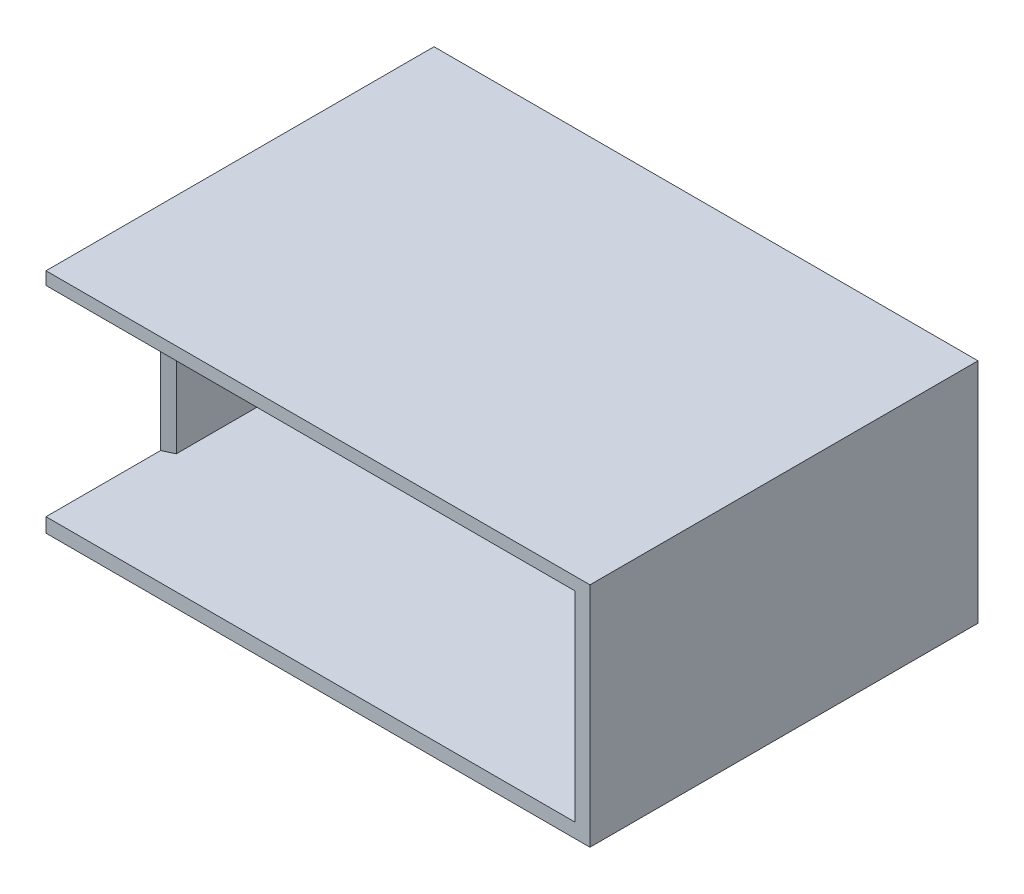
ISO-10303-21;
HEADER;
FILE_DESCRIPTION(('STEP AP214'),'2;1');
FILE_NAME('part.step','',(''),(''),'','','');
FILE_SCHEMA(('AUTOMOTIVE_DESIGN { 1 0 10303 214 1 1 1 1 }'));
ENDSEC;
DATA;
#1=APPLICATION_CONTEXT('core data for automotive mechanical design processes');
#2=APPLICATION_PROTOCOL_DEFINITION('international standard','automotive_design',2000,#1);
#3=PRODUCT_CONTEXT('',#1,'mechanical');
#4=PRODUCT('Part','Part','',(#3));
#5=PRODUCT_RELATED_PRODUCT_CATEGORY('part','',(#4));
#6=PRODUCT_DEFINITION_FORMATION('','',#4);
#7=PRODUCT_DEFINITION_CONTEXT('part definition',#1,'design');
#8=PRODUCT_DEFINITION('design','',#6,#7);
#9=PRODUCT_DEFINITION_SHAPE('','',#8);
#10=(LENGTH_UNIT() NAMED_UNIT(*) SI_UNIT(.MILLI.,.METRE.));
#11=(NAMED_UNIT(*) PLANE_ANGLE_UNIT() SI_UNIT($,.RADIAN.));
#12=(NAMED_UNIT(*) SI_UNIT($,.STERADIAN.) SOLID_ANGLE_UNIT());
#13=UNCERTAINTY_MEASURE_WITH_UNIT(LENGTH_MEASURE(1.E-05),#10,'distance_accuracy_value','');
#14=(GEOMETRIC_REPRESENTATION_CONTEXT(3) GLOBAL_UNCERTAINTY_ASSIGNED_CONTEXT((#13)) GLOBAL_UNIT_ASSIGNED_CONTEXT((#10,
#11,#12)) REPRESENTATION_CONTEXT('',''));
#15=CARTESIAN_POINT('',(0.,0.,0.));
#16=DIRECTION('',(0.,0.,1.));
#17=DIRECTION('',(1.,0.,0.));
#18=AXIS2_PLACEMENT_3D('',#15,#16,#17);
#19=CARTESIAN_POINT('',(0.,0.,25.));
#20=DIRECTION('',(0.,0.,1.));
#21=DIRECTION('',(1.,0.,0.));
#22=AXIS2_PLACEMENT_3D('',#19,#20,#21);
#23=PLANE('',#22);
#24=DIRECTION('',(0.,1.,0.));
#25=VECTOR('',#24,1.);
#26=CARTESIAN_POINT('',(167.877013546446,9.92918665697389,25.));
#27=LINE('',#26,#25);
#28=CARTESIAN_POINT('',(167.877013546446,-7.37195892888554,25.));
#29=VERTEX_POINT('',#28);
#30=CARTESIAN_POINT('',(167.877013546446,7.27222180922199,25.));
#31=VERTEX_POINT('',#30);
#32=EDGE_CURVE('E86',#29,#31,#27,.T.);
#33=ORIENTED_EDGE('',*,*,#32,.T.);
#34=DIRECTION('',(1.,0.,0.));
#35=VECTOR('',#34,1.);
#36=CARTESIAN_POINT('',(0.,7.27222180922201,25.));
#37=LINE('',#36,#35);
#38=CARTESIAN_POINT('',(132.830272958444,7.27222180922199,25.));
#39=VERTEX_POINT('',#38);
#40=EDGE_CURVE('E217',#39,#31,#37,.T.);
#41=ORIENTED_EDGE('',*,*,#40,.F.);
#42=DIRECTION('',(0.,-1.,0.));
#43=VECTOR('',#42,1.);
#44=CARTESIAN_POINT('',(132.830272958444,-41.717928267604,25.));
#45=LINE('',#44,#43);
#46=CARTESIAN_POINT('',(132.830272958444,6.44999999999998,25.));
#47=VERTEX_POINT('',#46);
#48=EDGE_CURVE('E234',#39,#47,#45,.T.);
#49=ORIENTED_EDGE('',*,*,#48,.T.);
#50=DIRECTION('',(-1.,0.,0.));
#51=VECTOR('',#50,1.);
#52=CARTESIAN_POINT('',(0.,6.44999999999997,25.));
#53=LINE('',#52,#51);
#54=CARTESIAN_POINT('',(166.919342789878,6.44999999999997,25.));
#55=VERTEX_POINT('',#54);
#56=EDGE_CURVE('E297',#55,#47,#53,.T.);
#57=ORIENTED_EDGE('',*,*,#56,.F.);
#58=DIRECTION('',(0.,-1.,0.));
#59=VECTOR('',#58,1.);
#60=CARTESIAN_POINT('',(166.919342789878,6.44999999999997,25.));
#61=LINE('',#60,#59);
#62=CARTESIAN_POINT('',(166.919342789878,-6.45000000000002,25.));
#63=VERTEX_POINT('',#62);
#64=EDGE_CURVE('E256',#55,#63,#61,.T.);
#65=ORIENTED_EDGE('',*,*,#64,.T.);
#66=DIRECTION('',(1.,0.,0.));
#67=VECTOR('',#66,1.);
#68=CARTESIAN_POINT('',(0.,-6.45000000000003,25.));
#69=LINE('',#68,#67);
#70=CARTESIAN_POINT('',(132.830272958444,-6.45000000000003,25.));
#71=VERTEX_POINT('',#70);
#72=EDGE_CURVE('E303',#71,#63,#69,.T.);
#73=ORIENTED_EDGE('',*,*,#72,.F.);
#74=CARTESIAN_POINT('',(132.830272958444,-7.37195892888554,25.));
#75=VERTEX_POINT('',#74);
#76=EDGE_CURVE('E230',#71,#75,#45,.T.);
#77=ORIENTED_EDGE('',*,*,#76,.T.);
#78=DIRECTION('',(-1.,0.,0.));
#79=VECTOR('',#78,1.);
#80=CARTESIAN_POINT('',(0.,-7.37195892888554,25.));
#81=LINE('',#80,#79);
#82=EDGE_CURVE('E211',#29,#75,#81,.T.);
#83=ORIENTED_EDGE('',*,*,#82,.F.);
#84=EDGE_LOOP('',(#33,#41,#49,#57,#65,#73,#77,#83));
#85=FACE_BOUND('',#84,.T.);
#86=ADVANCED_FACE('F71',(#85),#23,.T.);
#87=CARTESIAN_POINT('',(0.,0.,0.));
#88=DIRECTION('',(0.,0.,1.));
#89=DIRECTION('',(1.,0.,0.));
#90=AXIS2_PLACEMENT_3D('',#87,#88,#89);
#91=PLANE('',#90);
#92=DIRECTION('',(1.,0.,0.));
#93=VECTOR('',#92,1.);
#94=CARTESIAN_POINT('',(133.519342789878,6.44999999999997,0.));
#95=LINE('',#94,#93);
#96=CARTESIAN_POINT('',(133.519342789878,6.44999999999997,0.));
#97=VERTEX_POINT('',#96);
#98=CARTESIAN_POINT('',(166.919342789878,6.44999999999998,0.));
#99=VERTEX_POINT('',#98);
#100=EDGE_CURVE('E341',#97,#99,#95,.T.);
#101=ORIENTED_EDGE('',*,*,#100,.F.);
#102=DIRECTION('',(0.,1.,0.));
#103=VECTOR('',#102,1.);
#104=CARTESIAN_POINT('',(133.519342789878,-6.45000000000003,0.));
#105=LINE('',#104,#103);
#106=CARTESIAN_POINT('',(133.519342789878,-6.45000000000003,0.));
#107=VERTEX_POINT('',#106);
#108=EDGE_CURVE('E310',#107,#97,#105,.T.);
#109=ORIENTED_EDGE('',*,*,#108,.F.);
#110=DIRECTION('',(-1.,0.,0.));
#111=VECTOR('',#110,1.);
#112=CARTESIAN_POINT('',(133.519342789878,-6.45000000000003,0.));
#113=LINE('',#112,#111);
#114=CARTESIAN_POINT('',(166.919342789878,-6.45000000000002,0.));
#115=VERTEX_POINT('',#114);
#116=EDGE_CURVE('E324',#115,#107,#113,.T.);
#117=ORIENTED_EDGE('',*,*,#116,.F.);
#118=DIRECTION('',(0.,-1.,0.));
#119=VECTOR('',#118,1.);
#120=CARTESIAN_POINT('',(166.919342789878,-6.45000000000002,0.));
#121=LINE('',#120,#119);
#122=EDGE_CURVE('E344',#99,#115,#121,.T.);
#123=ORIENTED_EDGE('',*,*,#122,.F.);
#124=EDGE_LOOP('',(#101,#109,#117,#123));
#125=FACE_BOUND('',#124,.T.);
#126=DIRECTION('',(1.,0.,0.));
#127=VECTOR('',#126,1.);
#128=CARTESIAN_POINT('',(0.,7.27222180922201,0.));
#129=LINE('',#128,#127);
#130=CARTESIAN_POINT('',(132.830272958444,7.27222180922199,0.));
#131=VERTEX_POINT('',#130);
#132=CARTESIAN_POINT('',(167.877013546446,7.27222180922199,0.));
#133=VERTEX_POINT('',#132);
#134=EDGE_CURVE('E94',#131,#133,#129,.T.);
#135=ORIENTED_EDGE('',*,*,#134,.T.);
#136=DIRECTION('',(0.,1.,0.));
#137=VECTOR('',#136,1.);
#138=CARTESIAN_POINT('',(167.877013546446,9.92918665697389,0.));
#139=LINE('',#138,#137);
#140=CARTESIAN_POINT('',(167.877013546446,-7.37195892888554,0.));
#141=VERTEX_POINT('',#140);
#142=EDGE_CURVE('E196',#141,#133,#139,.T.);
#143=ORIENTED_EDGE('',*,*,#142,.F.);
#144=DIRECTION('',(-1.,0.,0.));
#145=VECTOR('',#144,1.);
#146=CARTESIAN_POINT('',(0.,-7.37195892888554,0.));
#147=LINE('',#146,#145);
#148=CARTESIAN_POINT('',(132.830272958444,-7.37195892888554,0.));
#149=VERTEX_POINT('',#148);
#150=EDGE_CURVE('E202',#141,#149,#147,.T.);
#151=ORIENTED_EDGE('',*,*,#150,.T.);
#152=DIRECTION('',(0.,-1.,0.));
#153=VECTOR('',#152,1.);
#154=CARTESIAN_POINT('',(132.830272958444,-41.717928267604,0.));
#155=LINE('',#154,#153);
#156=EDGE_CURVE('E223',#131,#149,#155,.T.);
#157=ORIENTED_EDGE('',*,*,#156,.F.);
#158=EDGE_LOOP('',(#135,#143,#151,#157));
#159=FACE_BOUND('',#158,.T.);
#160=ADVANCED_FACE('F73',(#125,#159),#91,.F.);
#161=CARTESIAN_POINT('',(132.830272958444,-41.717928267604,25.));
#162=DIRECTION('',(1.,0.,0.));
#163=DIRECTION('',(0.,0.,-1.));
#164=AXIS2_PLACEMENT_3D('',#161,#162,#163);
#165=PLANE('',#164);
#166=DIRECTION('',(0.,0.,-1.));
#167=VECTOR('',#166,1.);
#168=CARTESIAN_POINT('',(132.830272958444,-7.37195892888554,25.));
#169=LINE('',#168,#167);
#170=EDGE_CURVE('E208',#75,#149,#169,.T.);
#171=ORIENTED_EDGE('',*,*,#170,.F.);
#172=ORIENTED_EDGE('',*,*,#76,.F.);
#173=DIRECTION('',(0.,0.,1.));
#174=VECTOR('',#173,1.);
#175=CARTESIAN_POINT('',(132.830272958444,-6.45000000000003,4.5));
#176=LINE('',#175,#174);
#177=CARTESIAN_POINT('',(132.830272958444,-6.45,17.6198764834851));
#178=VERTEX_POINT('',#177);
#179=EDGE_CURVE('E241',#178,#71,#176,.T.);
#180=ORIENTED_EDGE('',*,*,#179,.F.);
#181=DIRECTION('',(0.,-1.,0.));
#182=VECTOR('',#181,1.);
#183=CARTESIAN_POINT('',(132.830272958444,6.45,17.6198764834851));
#184=LINE('',#183,#182);
#185=CARTESIAN_POINT('',(132.830272958444,6.45,17.6198764834851));
#186=VERTEX_POINT('',#185);
#187=EDGE_CURVE('E80',#186,#178,#184,.T.);
#188=ORIENTED_EDGE('',*,*,#187,.F.);
#189=DIRECTION('',(0.,0.,-1.));
#190=VECTOR('',#189,1.);
#191=CARTESIAN_POINT('',(132.830272958444,6.44999999999997,4.5));
#192=LINE('',#191,#190);
#193=EDGE_CURVE('E237',#47,#186,#192,.T.);
#194=ORIENTED_EDGE('',*,*,#193,.F.);
#195=ORIENTED_EDGE('',*,*,#48,.F.);
#196=DIRECTION('',(0.,0.,-1.));
#197=VECTOR('',#196,1.);
#198=CARTESIAN_POINT('',(132.830272958444,7.27222180922199,25.));
#199=LINE('',#198,#197);
#200=EDGE_CURVE('E212',#39,#131,#199,.T.);
#201=ORIENTED_EDGE('',*,*,#200,.T.);
#202=ORIENTED_EDGE('',*,*,#156,.T.);
#203=EDGE_LOOP('',(#171,#172,#180,#188,#194,#195,#201,#202));
#204=FACE_BOUND('',#203,.T.);
#205=ADVANCED_FACE('F410',(#204),#165,.F.);
#206=CARTESIAN_POINT('',(0.,0.,4.5));
#207=DIRECTION('',(0.,0.,-1.));
#208=DIRECTION('',(-1.,0.,0.));
#209=AXIS2_PLACEMENT_3D('',#206,#207,#208);
#210=PLANE('',#209);
#211=CARTESIAN_POINT('',(136.75,0.,4.5));
#212=DIRECTION('',(0.,0.,-1.));
#213=DIRECTION('',(-1.,0.,0.));
#214=AXIS2_PLACEMENT_3D('',#211,#212,#213);
#215=CIRCLE('',#214,1.09999999999999);
#216=CARTESIAN_POINT('',(135.65,0.,4.5));
#217=VERTEX_POINT('',#216);
#218=EDGE_CURVE('E251',#217,#217,#215,.T.);
#219=ORIENTED_EDGE('',*,*,#218,.F.);
#220=EDGE_LOOP('',(#219));
#221=FACE_BOUND('',#220,.T.);
#222=DIRECTION('',(1.,0.,0.));
#223=VECTOR('',#222,1.);
#224=CARTESIAN_POINT('',(133.519342789878,6.44999999999997,4.5));
#225=LINE('',#224,#223);
#226=CARTESIAN_POINT('',(133.519342789878,6.44999999999997,4.5));
#227=VERTEX_POINT('',#226);
#228=CARTESIAN_POINT('',(138.419342789878,6.44999999999997,4.5));
#229=VERTEX_POINT('',#228);
#230=EDGE_CURVE('E325',#227,#229,#225,.T.);
#231=ORIENTED_EDGE('',*,*,#230,.T.);
#232=DIRECTION('',(0.,-1.,0.));
#233=VECTOR('',#232,1.);
#234=CARTESIAN_POINT('',(138.419342789878,0.,4.5));
#235=LINE('',#234,#233);
#236=CARTESIAN_POINT('',(138.419342789878,-6.45000000000003,4.5));
#237=VERTEX_POINT('',#236);
#238=EDGE_CURVE('E368',#229,#237,#235,.T.);
#239=ORIENTED_EDGE('',*,*,#238,.T.);
#240=DIRECTION('',(-1.,0.,0.));
#241=VECTOR('',#240,1.);
#242=CARTESIAN_POINT('',(133.519342789878,-6.45000000000003,4.5));
#243=LINE('',#242,#241);
#244=CARTESIAN_POINT('',(133.519342789878,-6.45000000000003,4.5));
#245=VERTEX_POINT('',#244);
#246=EDGE_CURVE('E333',#237,#245,#243,.T.);
#247=ORIENTED_EDGE('',*,*,#246,.T.);
#248=DIRECTION('',(0.,1.,0.));
#249=VECTOR('',#248,1.);
#250=CARTESIAN_POINT('',(133.519342789878,-6.45000000000003,4.5));
#251=LINE('',#250,#249);
#252=EDGE_CURVE('E319',#245,#227,#251,.T.);
#253=ORIENTED_EDGE('',*,*,#252,.T.);
#254=EDGE_LOOP('',(#231,#239,#247,#253));
#255=FACE_BOUND('',#254,.T.);
#256=ADVANCED_FACE('F421',(#221,#255),#210,.T.);
#257=CARTESIAN_POINT('',(133.519342789878,-6.45000000000003,4.5));
#258=DIRECTION('',(-1.,0.,0.));
#259=DIRECTION('',(0.,0.,1.));
#260=AXIS2_PLACEMENT_3D('',#257,#258,#259);
#261=PLANE('',#260);
#262=ORIENTED_EDGE('',*,*,#108,.T.);
#263=DIRECTION('',(0.,0.,-1.));
#264=VECTOR('',#263,1.);
#265=CARTESIAN_POINT('',(133.519342789878,6.44999999999997,4.5));
#266=LINE('',#265,#264);
#267=EDGE_CURVE('E338',#227,#97,#266,.T.);
#268=ORIENTED_EDGE('',*,*,#267,.F.);
#269=ORIENTED_EDGE('',*,*,#252,.F.);
#270=DIRECTION('',(0.,0.,-1.));
#271=VECTOR('',#270,1.);
#272=CARTESIAN_POINT('',(133.519342789878,-6.45000000000003,4.5));
#273=LINE('',#272,#271);
#274=EDGE_CURVE('E350',#245,#107,#273,.T.);
#275=ORIENTED_EDGE('',*,*,#274,.T.);
#276=EDGE_LOOP('',(#262,#268,#269,#275));
#277=FACE_BOUND('',#276,.T.);
#278=ADVANCED_FACE('F427',(#277),#261,.F.);
#279=CARTESIAN_POINT('',(133.519342789878,-6.45000000000003,4.5));
#280=DIRECTION('',(0.,-1.,0.));
#281=DIRECTION('',(1.,0.,0.));
#282=AXIS2_PLACEMENT_3D('',#279,#280,#281);
#283=PLANE('',#282);
#284=DIRECTION('',(0.905458935958869,0.,-0.42443387623072));
#285=VECTOR('',#284,1.);
#286=CARTESIAN_POINT('',(30.7000417355666,-6.45,65.4934223692087));
#287=LINE('',#286,#285);
#288=CARTESIAN_POINT('',(133.519342789878,-6.45,17.296875));
#289=VERTEX_POINT('',#288);
#290=EDGE_CURVE('E293',#178,#289,#287,.T.);
#291=ORIENTED_EDGE('',*,*,#290,.F.);
#292=ORIENTED_EDGE('',*,*,#179,.T.);
#293=ORIENTED_EDGE('',*,*,#72,.T.);
#294=DIRECTION('',(0.,0.,-1.));
#295=VECTOR('',#294,1.);
#296=CARTESIAN_POINT('',(166.919342789878,-6.45000000000002,25.));
#297=LINE('',#296,#295);
#298=CARTESIAN_POINT('',(166.919342789878,-6.45000000000002,6.5));
#299=VERTEX_POINT('',#298);
#300=EDGE_CURVE('E260',#63,#299,#297,.T.);
#301=ORIENTED_EDGE('',*,*,#300,.T.);
#302=DIRECTION('',(-1.,0.,0.));
#303=VECTOR('',#302,1.);
#304=CARTESIAN_POINT('',(166.919342789878,-6.45000000000002,6.5));
#305=LINE('',#304,#303);
#306=CARTESIAN_POINT('',(162.019342789878,-6.45000000000002,6.5));
#307=VERTEX_POINT('',#306);
#308=EDGE_CURVE('E266',#299,#307,#305,.T.);
#309=ORIENTED_EDGE('',*,*,#308,.T.);
#310=DIRECTION('',(0.,0.,-1.));
#311=VECTOR('',#310,1.);
#312=CARTESIAN_POINT('',(162.019342789878,-6.45000000000002,25.));
#313=LINE('',#312,#311);
#314=CARTESIAN_POINT('',(162.019342789878,-6.45000000000002,4.5));
#315=VERTEX_POINT('',#314);
#316=EDGE_CURVE('E311',#307,#315,#313,.T.);
#317=ORIENTED_EDGE('',*,*,#316,.T.);
#318=CARTESIAN_POINT('',(166.919342789878,-6.45000000000002,4.5));
#319=VERTEX_POINT('',#318);
#320=EDGE_CURVE('E334',#319,#315,#243,.T.);
#321=ORIENTED_EDGE('',*,*,#320,.F.);
#322=DIRECTION('',(0.,0.,-1.));
#323=VECTOR('',#322,1.);
#324=CARTESIAN_POINT('',(166.919342789878,-6.45000000000002,4.5));
#325=LINE('',#324,#323);
#326=EDGE_CURVE('E355',#319,#115,#325,.T.);
#327=ORIENTED_EDGE('',*,*,#326,.T.);
#328=ORIENTED_EDGE('',*,*,#116,.T.);
#329=ORIENTED_EDGE('',*,*,#274,.F.);
#330=ORIENTED_EDGE('',*,*,#246,.F.);
#331=DIRECTION('',(0.,0.,-1.));
#332=VECTOR('',#331,1.);
#333=CARTESIAN_POINT('',(138.419342789878,-6.45000000000003,25.));
#334=LINE('',#333,#332);
#335=CARTESIAN_POINT('',(138.419342789878,-6.45000000000002,6.5));
#336=VERTEX_POINT('',#335);
#337=EDGE_CURVE('E307',#336,#237,#334,.T.);
#338=ORIENTED_EDGE('',*,*,#337,.F.);
#339=CARTESIAN_POINT('',(133.519342789878,-6.45000000000002,6.5));
#340=VERTEX_POINT('',#339);
#341=EDGE_CURVE('E265',#336,#340,#305,.T.);
#342=ORIENTED_EDGE('',*,*,#341,.T.);
#343=DIRECTION('',(0.,0.,-1.));
#344=VECTOR('',#343,1.);
#345=CARTESIAN_POINT('',(133.519342789878,-6.45000000000002,25.));
#346=LINE('',#345,#344);
#347=EDGE_CURVE('E286',#289,#340,#346,.T.);
#348=ORIENTED_EDGE('',*,*,#347,.F.);
#349=EDGE_LOOP('',(#291,#292,#293,#301,#309,#317,#321,#327,#328,#329,#330,#338,#342,#348));
#350=FACE_BOUND('',#349,.T.);
#351=ADVANCED_FACE('F395',(#350),#283,.F.);
#352=CARTESIAN_POINT('',(166.919342789878,-6.45000000000002,4.5));
#353=DIRECTION('',(1.,0.,0.));
#354=DIRECTION('',(0.,0.,-1.));
#355=AXIS2_PLACEMENT_3D('',#352,#353,#354);
#356=PLANE('',#355);
#357=ORIENTED_EDGE('',*,*,#122,.T.);
#358=ORIENTED_EDGE('',*,*,#326,.F.);
#359=DIRECTION('',(0.,-1.,0.));
#360=VECTOR('',#359,1.);
#361=CARTESIAN_POINT('',(166.919342789878,-6.45000000000002,4.5));
#362=LINE('',#361,#360);
#363=CARTESIAN_POINT('',(166.919342789878,6.44999999999998,4.5));
#364=VERTEX_POINT('',#363);
#365=EDGE_CURVE('E329',#364,#319,#362,.T.);
#366=ORIENTED_EDGE('',*,*,#365,.F.);
#367=DIRECTION('',(0.,0.,-1.));
#368=VECTOR('',#367,1.);
#369=CARTESIAN_POINT('',(166.919342789878,6.44999999999998,4.5));
#370=LINE('',#369,#368);
#371=EDGE_CURVE('E358',#364,#99,#370,.T.);
#372=ORIENTED_EDGE('',*,*,#371,.T.);
#373=EDGE_LOOP('',(#357,#358,#366,#372));
#374=FACE_BOUND('',#373,.T.);
#375=ADVANCED_FACE('F460',(#374),#356,.F.);
#376=CARTESIAN_POINT('',(133.519342789878,6.44999999999997,4.5));
#377=DIRECTION('',(0.,1.,0.));
#378=DIRECTION('',(-1.,0.,0.));
#379=AXIS2_PLACEMENT_3D('',#376,#377,#378);
#380=PLANE('',#379);
#381=ORIENTED_EDGE('',*,*,#56,.T.);
#382=ORIENTED_EDGE('',*,*,#193,.T.);
#383=DIRECTION('',(0.905458935958869,0.,-0.42443387623072));
#384=VECTOR('',#383,1.);
#385=CARTESIAN_POINT('',(30.7000417355666,6.45,65.4934223692087));
#386=LINE('',#385,#384);
#387=CARTESIAN_POINT('',(133.519342789878,6.44999999999997,17.296875));
#388=VERTEX_POINT('',#387);
#389=EDGE_CURVE('E294',#186,#388,#386,.T.);
#390=ORIENTED_EDGE('',*,*,#389,.T.);
#391=DIRECTION('',(0.,0.,-1.));
#392=VECTOR('',#391,1.);
#393=CARTESIAN_POINT('',(133.519342789878,6.44999999999997,25.));
#394=LINE('',#393,#392);
#395=CARTESIAN_POINT('',(133.519342789878,6.44999999999997,6.5));
#396=VERTEX_POINT('',#395);
#397=EDGE_CURVE('E283',#388,#396,#394,.T.);
#398=ORIENTED_EDGE('',*,*,#397,.T.);
#399=DIRECTION('',(1.,0.,0.));
#400=VECTOR('',#399,1.);
#401=CARTESIAN_POINT('',(166.919342789878,6.44999999999997,6.5));
#402=LINE('',#401,#400);
#403=CARTESIAN_POINT('',(138.419342789878,6.44999999999997,6.5));
#404=VERTEX_POINT('',#403);
#405=EDGE_CURVE('E261',#396,#404,#402,.T.);
#406=ORIENTED_EDGE('',*,*,#405,.T.);
#407=DIRECTION('',(0.,0.,-1.));
#408=VECTOR('',#407,1.);
#409=CARTESIAN_POINT('',(138.419342789878,6.44999999999997,25.));
#410=LINE('',#409,#408);
#411=EDGE_CURVE('E306',#404,#229,#410,.T.);
#412=ORIENTED_EDGE('',*,*,#411,.T.);
#413=ORIENTED_EDGE('',*,*,#230,.F.);
#414=ORIENTED_EDGE('',*,*,#267,.T.);
#415=ORIENTED_EDGE('',*,*,#100,.T.);
#416=ORIENTED_EDGE('',*,*,#371,.F.);
#417=CARTESIAN_POINT('',(162.019342789878,6.44999999999998,4.5));
#418=VERTEX_POINT('',#417);
#419=EDGE_CURVE('E323',#418,#364,#225,.T.);
#420=ORIENTED_EDGE('',*,*,#419,.F.);
#421=DIRECTION('',(0.,0.,-1.));
#422=VECTOR('',#421,1.);
#423=CARTESIAN_POINT('',(162.019342789878,6.44999999999998,25.));
#424=LINE('',#423,#422);
#425=CARTESIAN_POINT('',(162.019342789878,6.44999999999998,6.5));
#426=VERTEX_POINT('',#425);
#427=EDGE_CURVE('E314',#426,#418,#424,.T.);
#428=ORIENTED_EDGE('',*,*,#427,.F.);
#429=CARTESIAN_POINT('',(166.919342789878,6.44999999999997,6.5));
#430=VERTEX_POINT('',#429);
#431=EDGE_CURVE('E274',#426,#430,#402,.T.);
#432=ORIENTED_EDGE('',*,*,#431,.T.);
#433=DIRECTION('',(0.,0.,-1.));
#434=VECTOR('',#433,1.);
#435=CARTESIAN_POINT('',(166.919342789878,6.44999999999997,25.));
#436=LINE('',#435,#434);
#437=EDGE_CURVE('E278',#55,#430,#436,.T.);
#438=ORIENTED_EDGE('',*,*,#437,.F.);
#439=EDGE_LOOP('',(#381,#382,#390,#398,#406,#412,#413,#414,#415,#416,#420,#428,#432,#438));
#440=FACE_BOUND('',#439,.T.);
#441=ADVANCED_FACE('F406',(#440),#380,.F.);
#442=CARTESIAN_POINT('',(163.75,0.,4.5));
#443=DIRECTION('',(0.,0.,-1.));
#444=DIRECTION('',(-1.,0.,0.));
#445=AXIS2_PLACEMENT_3D('',#442,#443,#444);
#446=CIRCLE('',#445,1.09999999999999);
#447=CARTESIAN_POINT('',(162.65,0.,4.5));
#448=VERTEX_POINT('',#447);
#449=EDGE_CURVE('E246',#448,#448,#446,.T.);
#450=ORIENTED_EDGE('',*,*,#449,.F.);
#451=EDGE_LOOP('',(#450));
#452=FACE_BOUND('',#451,.T.);
#453=DIRECTION('',(0.,-1.,0.));
#454=VECTOR('',#453,1.);
#455=CARTESIAN_POINT('',(162.019342789878,0.,4.5));
#456=LINE('',#455,#454);
#457=EDGE_CURVE('E354',#418,#315,#456,.T.);
#458=ORIENTED_EDGE('',*,*,#457,.F.);
#459=ORIENTED_EDGE('',*,*,#419,.T.);
#460=ORIENTED_EDGE('',*,*,#365,.T.);
#461=ORIENTED_EDGE('',*,*,#320,.T.);
#462=EDGE_LOOP('',(#458,#459,#460,#461));
#463=FACE_BOUND('',#462,.T.);
#464=ADVANCED_FACE('F459',(#452,#463),#210,.T.);
#465=CARTESIAN_POINT('',(138.419342789878,0.,25.));
#466=DIRECTION('',(1.,0.,0.));
#467=DIRECTION('',(0.,0.,-1.));
#468=AXIS2_PLACEMENT_3D('',#465,#466,#467);
#469=PLANE('',#468);
#470=DIRECTION('',(0.,1.,0.));
#471=VECTOR('',#470,1.);
#472=CARTESIAN_POINT('',(138.419342789878,0.,6.5));
#473=LINE('',#472,#471);
#474=EDGE_CURVE('E282',#336,#404,#473,.T.);
#475=ORIENTED_EDGE('',*,*,#474,.F.);
#476=ORIENTED_EDGE('',*,*,#337,.T.);
#477=ORIENTED_EDGE('',*,*,#238,.F.);
#478=ORIENTED_EDGE('',*,*,#411,.F.);
#479=EDGE_LOOP('',(#475,#476,#477,#478));
#480=FACE_BOUND('',#479,.T.);
#481=ADVANCED_FACE('F432',(#480),#469,.T.);
#482=CARTESIAN_POINT('',(162.019342789878,0.,25.));
#483=DIRECTION('',(1.,0.,0.));
#484=DIRECTION('',(0.,0.,-1.));
#485=AXIS2_PLACEMENT_3D('',#482,#483,#484);
#486=PLANE('',#485);
#487=ORIENTED_EDGE('',*,*,#316,.F.);
#488=DIRECTION('',(0.,1.,0.));
#489=VECTOR('',#488,1.);
#490=CARTESIAN_POINT('',(162.019342789878,0.,6.5));
#491=LINE('',#490,#489);
#492=EDGE_CURVE('E376',#307,#426,#491,.T.);
#493=ORIENTED_EDGE('',*,*,#492,.T.);
#494=ORIENTED_EDGE('',*,*,#427,.T.);
#495=ORIENTED_EDGE('',*,*,#457,.T.);
#496=EDGE_LOOP('',(#487,#493,#494,#495));
#497=FACE_BOUND('',#496,.T.);
#498=ADVANCED_FACE('F470',(#497),#486,.F.);
#499=CARTESIAN_POINT('',(30.7000417355666,6.45,65.4934223692087));
#500=DIRECTION('',(-0.42443387623072,0.,-0.905458935958868));
#501=DIRECTION('',(-0.905458935958869,0.,0.42443387623072));
#502=AXIS2_PLACEMENT_3D('',#499,#500,#501);
#503=PLANE('',#502);
#504=ORIENTED_EDGE('',*,*,#389,.F.);
#505=ORIENTED_EDGE('',*,*,#187,.T.);
#506=ORIENTED_EDGE('',*,*,#290,.T.);
#507=DIRECTION('',(0.,1.,0.));
#508=VECTOR('',#507,1.);
#509=CARTESIAN_POINT('',(133.519342789878,6.45,17.296875));
#510=LINE('',#509,#508);
#511=EDGE_CURVE('E372',#289,#388,#510,.T.);
#512=ORIENTED_EDGE('',*,*,#511,.T.);
#513=EDGE_LOOP('',(#504,#505,#506,#512));
#514=FACE_BOUND('',#513,.T.);
#515=ADVANCED_FACE('F390',(#514),#503,.F.);
#516=CARTESIAN_POINT('',(133.519342789878,6.44999999999997,25.));
#517=DIRECTION('',(-1.,0.,0.));
#518=DIRECTION('',(0.,0.,1.));
#519=AXIS2_PLACEMENT_3D('',#516,#517,#518);
#520=PLANE('',#519);
#521=ORIENTED_EDGE('',*,*,#347,.T.);
#522=DIRECTION('',(0.,1.,0.));
#523=VECTOR('',#522,1.);
#524=CARTESIAN_POINT('',(133.519342789878,6.44999999999997,6.5));
#525=LINE('',#524,#523);
#526=EDGE_CURVE('E270',#340,#396,#525,.T.);
#527=ORIENTED_EDGE('',*,*,#526,.T.);
#528=ORIENTED_EDGE('',*,*,#397,.F.);
#529=ORIENTED_EDGE('',*,*,#511,.F.);
#530=EDGE_LOOP('',(#521,#527,#528,#529));
#531=FACE_BOUND('',#530,.T.);
#532=ADVANCED_FACE('F403',(#531),#520,.F.);
#533=CARTESIAN_POINT('',(0.,0.,6.5));
#534=DIRECTION('',(0.,0.,-1.));
#535=DIRECTION('',(-1.,0.,0.));
#536=AXIS2_PLACEMENT_3D('',#533,#534,#535);
#537=PLANE('',#536);
#538=CARTESIAN_POINT('',(136.75,0.,6.5));
#539=DIRECTION('',(0.,0.,-1.));
#540=DIRECTION('',(-1.,0.,0.));
#541=AXIS2_PLACEMENT_3D('',#538,#539,#540);
#542=CIRCLE('',#541,1.09999999999999);
#543=CARTESIAN_POINT('',(135.65,0.,6.5));
#544=VERTEX_POINT('',#543);
#545=EDGE_CURVE('E250',#544,#544,#542,.T.);
#546=ORIENTED_EDGE('',*,*,#545,.T.);
#547=EDGE_LOOP('',(#546));
#548=FACE_BOUND('',#547,.T.);
#549=ORIENTED_EDGE('',*,*,#474,.T.);
#550=ORIENTED_EDGE('',*,*,#405,.F.);
#551=ORIENTED_EDGE('',*,*,#526,.F.);
#552=ORIENTED_EDGE('',*,*,#341,.F.);
#553=EDGE_LOOP('',(#549,#550,#551,#552));
#554=FACE_BOUND('',#553,.T.);
#555=ADVANCED_FACE('F434',(#548,#554),#537,.F.);
#556=CARTESIAN_POINT('',(163.75,0.,6.5));
#557=DIRECTION('',(0.,0.,-1.));
#558=DIRECTION('',(-1.,0.,0.));
#559=AXIS2_PLACEMENT_3D('',#556,#557,#558);
#560=CIRCLE('',#559,1.09999999999999);
#561=CARTESIAN_POINT('',(162.65,0.,6.5));
#562=VERTEX_POINT('',#561);
#563=EDGE_CURVE('E245',#562,#562,#560,.T.);
#564=ORIENTED_EDGE('',*,*,#563,.T.);
#565=EDGE_LOOP('',(#564));
#566=FACE_BOUND('',#565,.T.);
#567=ORIENTED_EDGE('',*,*,#308,.F.);
#568=DIRECTION('',(0.,-1.,0.));
#569=VECTOR('',#568,1.);
#570=CARTESIAN_POINT('',(166.919342789878,6.44999999999997,6.5));
#571=LINE('',#570,#569);
#572=EDGE_CURVE('E255',#430,#299,#571,.T.);
#573=ORIENTED_EDGE('',*,*,#572,.F.);
#574=ORIENTED_EDGE('',*,*,#431,.F.);
#575=ORIENTED_EDGE('',*,*,#492,.F.);
#576=EDGE_LOOP('',(#567,#573,#574,#575));
#577=FACE_BOUND('',#576,.T.);
#578=ADVANCED_FACE('F436',(#566,#577),#537,.F.);
#579=CARTESIAN_POINT('',(166.919342789878,6.44999999999997,25.));
#580=DIRECTION('',(1.,0.,0.));
#581=DIRECTION('',(0.,0.,-1.));
#582=AXIS2_PLACEMENT_3D('',#579,#580,#581);
#583=PLANE('',#582);
#584=ORIENTED_EDGE('',*,*,#572,.T.);
#585=ORIENTED_EDGE('',*,*,#300,.F.);
#586=ORIENTED_EDGE('',*,*,#64,.F.);
#587=ORIENTED_EDGE('',*,*,#437,.T.);
#588=EDGE_LOOP('',(#584,#585,#586,#587));
#589=FACE_BOUND('',#588,.T.);
#590=ADVANCED_FACE('F443',(#589),#583,.F.);
#591=CARTESIAN_POINT('',(163.75,0.,25.));
#592=DIRECTION('',(0.,0.,-1.));
#593=DIRECTION('',(-1.,0.,0.));
#594=AXIS2_PLACEMENT_3D('',#591,#592,#593);
#595=CYLINDRICAL_SURFACE('',#594,1.09999999999999);
#596=ORIENTED_EDGE('',*,*,#449,.T.);
#597=EDGE_LOOP('',(#596));
#598=FACE_BOUND('',#597,.T.);
#599=ORIENTED_EDGE('',*,*,#563,.F.);
#600=EDGE_LOOP('',(#599));
#601=FACE_BOUND('',#600,.T.);
#602=ADVANCED_FACE('F477',(#598,#601),#595,.F.);
#603=CARTESIAN_POINT('',(136.75,0.,25.));
#604=DIRECTION('',(0.,0.,-1.));
#605=DIRECTION('',(-1.,0.,0.));
#606=AXIS2_PLACEMENT_3D('',#603,#604,#605);
#607=CYLINDRICAL_SURFACE('',#606,1.09999999999999);
#608=ORIENTED_EDGE('',*,*,#218,.T.);
#609=EDGE_LOOP('',(#608));
#610=FACE_BOUND('',#609,.T.);
#611=ORIENTED_EDGE('',*,*,#545,.F.);
#612=EDGE_LOOP('',(#611));
#613=FACE_BOUND('',#612,.T.);
#614=ADVANCED_FACE('F483',(#610,#613),#607,.F.);
#615=CARTESIAN_POINT('',(0.,7.27222180922201,25.));
#616=DIRECTION('',(0.,1.,0.));
#617=DIRECTION('',(-1.,0.,0.));
#618=AXIS2_PLACEMENT_3D('',#615,#616,#617);
#619=PLANE('',#618);
#620=DIRECTION('',(0.,0.,1.));
#621=VECTOR('',#620,1.);
#622=CARTESIAN_POINT('',(167.877013546446,7.27222180922199,25.));
#623=LINE('',#622,#621);
#624=EDGE_CURVE('E228',#133,#31,#623,.T.);
#625=ORIENTED_EDGE('',*,*,#624,.F.);
#626=ORIENTED_EDGE('',*,*,#134,.F.);
#627=ORIENTED_EDGE('',*,*,#200,.F.);
#628=ORIENTED_EDGE('',*,*,#40,.T.);
#629=EDGE_LOOP('',(#625,#626,#627,#628));
#630=FACE_BOUND('',#629,.T.);
#631=ADVANCED_FACE('F502',(#630),#619,.T.);
#632=CARTESIAN_POINT('',(0.,-7.37195892888554,25.));
#633=DIRECTION('',(0.,-1.,0.));
#634=DIRECTION('',(0.,0.,-1.));
#635=AXIS2_PLACEMENT_3D('',#632,#633,#634);
#636=PLANE('',#635);
#637=DIRECTION('',(0.,0.,-1.));
#638=VECTOR('',#637,1.);
#639=CARTESIAN_POINT('',(167.877013546446,-7.37195892888554,25.));
#640=LINE('',#639,#638);
#641=EDGE_CURVE('E12',#29,#141,#640,.T.);
#642=ORIENTED_EDGE('',*,*,#641,.F.);
#643=ORIENTED_EDGE('',*,*,#82,.T.);
#644=ORIENTED_EDGE('',*,*,#170,.T.);
#645=ORIENTED_EDGE('',*,*,#150,.F.);
#646=EDGE_LOOP('',(#642,#643,#644,#645));
#647=FACE_BOUND('',#646,.T.);
#648=ADVANCED_FACE('F206',(#647),#636,.T.);
#649=CARTESIAN_POINT('',(167.877013546446,9.92918665697389,25.));
#650=DIRECTION('',(-1.,0.,0.));
#651=DIRECTION('',(0.,0.,1.));
#652=AXIS2_PLACEMENT_3D('',#649,#650,#651);
#653=PLANE('',#652);
#654=ORIENTED_EDGE('',*,*,#624,.T.);
#655=ORIENTED_EDGE('',*,*,#32,.F.);
#656=ORIENTED_EDGE('',*,*,#641,.T.);
#657=ORIENTED_EDGE('',*,*,#142,.T.);
#658=EDGE_LOOP('',(#654,#655,#656,#657));
#659=FACE_BOUND('',#658,.T.);
#660=ADVANCED_FACE('F195',(#659),#653,.F.);
#661=CLOSED_SHELL('',(#86,#160,#205,#256,#278,#351,#375,#441,#464,#481,#498,#515,#532,#555,#578,
#590,#602,#614,#631,#648,#660));
#662=MANIFOLD_SOLID_BREP('B2',#661);
#663=ADVANCED_BREP_SHAPE_REPRESENTATION('',(#18,#662),#14);
#664=SHAPE_DEFINITION_REPRESENTATION(#9,#663);
ENDSEC;
END-ISO-10303-21;
